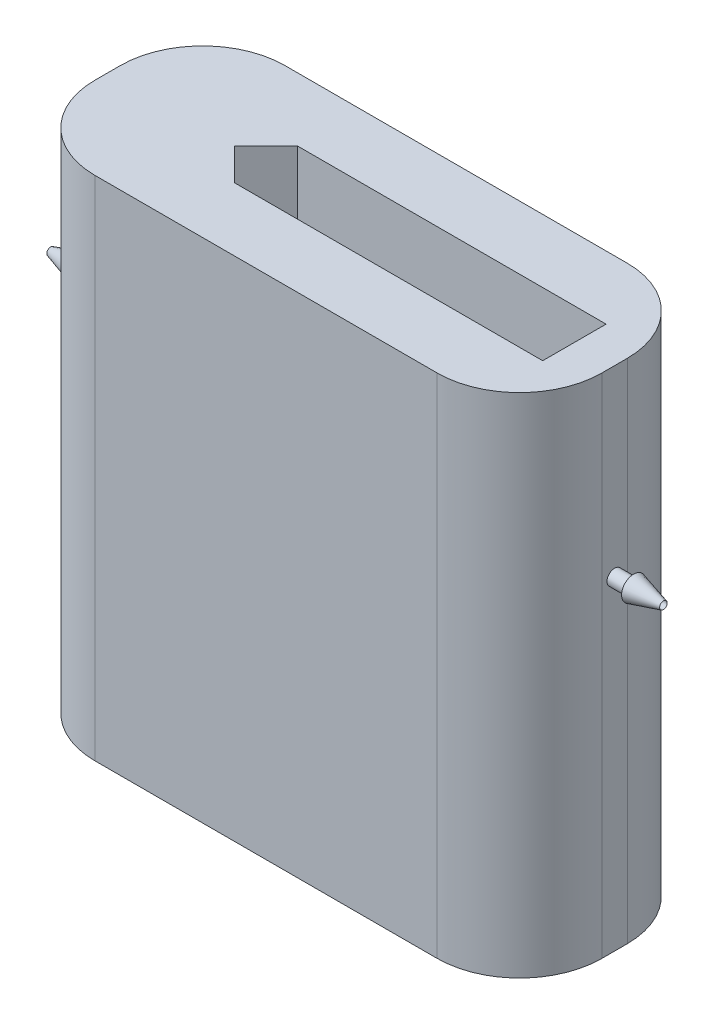
ISO-10303-21;
HEADER;
FILE_DESCRIPTION(('STEP AP214'),'2;1');
FILE_NAME('part.step','',(''),(''),'','','');
FILE_SCHEMA(('AUTOMOTIVE_DESIGN { 1 0 10303 214 1 1 1 1 }'));
ENDSEC;
DATA;
#1=APPLICATION_CONTEXT('core data for automotive mechanical design processes');
#2=APPLICATION_PROTOCOL_DEFINITION('international standard','automotive_design',2000,#1);
#3=PRODUCT_CONTEXT('',#1,'mechanical');
#4=PRODUCT('Part','Part','',(#3));
#5=PRODUCT_RELATED_PRODUCT_CATEGORY('part','',(#4));
#6=PRODUCT_DEFINITION_FORMATION('','',#4);
#7=PRODUCT_DEFINITION_CONTEXT('part definition',#1,'design');
#8=PRODUCT_DEFINITION('design','',#6,#7);
#9=PRODUCT_DEFINITION_SHAPE('','',#8);
#10=(LENGTH_UNIT() NAMED_UNIT(*) SI_UNIT(.MILLI.,.METRE.));
#11=(NAMED_UNIT(*) PLANE_ANGLE_UNIT() SI_UNIT($,.RADIAN.));
#12=(NAMED_UNIT(*) SI_UNIT($,.STERADIAN.) SOLID_ANGLE_UNIT());
#13=UNCERTAINTY_MEASURE_WITH_UNIT(LENGTH_MEASURE(1.E-05),#10,'distance_accuracy_value','');
#14=(GEOMETRIC_REPRESENTATION_CONTEXT(3) GLOBAL_UNCERTAINTY_ASSIGNED_CONTEXT((#13)) GLOBAL_UNIT_ASSIGNED_CONTEXT((#10,
#11,#12)) REPRESENTATION_CONTEXT('',''));
#15=CARTESIAN_POINT('',(0.,0.,0.));
#16=DIRECTION('',(0.,0.,1.));
#17=DIRECTION('',(1.,0.,0.));
#18=AXIS2_PLACEMENT_3D('',#15,#16,#17);
#19=CARTESIAN_POINT('',(43.,51.1119598949633,0.));
#20=DIRECTION('',(-1.,0.,0.));
#21=DIRECTION('',(0.,0.,1.));
#22=AXIS2_PLACEMENT_3D('',#19,#20,#21);
#23=PLANE('',#22);
#24=CARTESIAN_POINT('',(43.,51.1119598949633,0.));
#25=DIRECTION('',(-1.,0.,0.));
#26=DIRECTION('',(0.,0.,1.));
#27=AXIS2_PLACEMENT_3D('',#24,#25,#26);
#28=CIRCLE('',#27,0.800000000000001);
#29=CARTESIAN_POINT('',(43.,51.1119598949633,0.800000000000001));
#30=VERTEX_POINT('',#29);
#31=EDGE_CURVE('E54',#30,#30,#28,.T.);
#32=ORIENTED_EDGE('',*,*,#31,.F.);
#33=EDGE_LOOP('',(#32));
#34=FACE_BOUND('',#33,.T.);
#35=CARTESIAN_POINT('',(43.,51.1119598949633,0.));
#36=DIRECTION('',(-1.,0.,0.));
#37=DIRECTION('',(0.,0.,1.));
#38=AXIS2_PLACEMENT_3D('',#35,#36,#37);
#39=CIRCLE('',#38,1.90135651755513);
#40=CARTESIAN_POINT('',(43.,51.1119598949633,1.90135651755513));
#41=VERTEX_POINT('',#40);
#42=EDGE_CURVE('E11',#41,#41,#39,.T.);
#43=ORIENTED_EDGE('',*,*,#42,.T.);
#44=EDGE_LOOP('',(#43));
#45=FACE_BOUND('',#44,.T.);
#46=ADVANCED_FACE('F51',(#34,#45),#23,.T.);
#47=CARTESIAN_POINT('',(47.7051492827357,51.1119598949633,0.));
#48=DIRECTION('',(-1.,0.,0.));
#49=DIRECTION('',(0.,0.,1.));
#50=AXIS2_PLACEMENT_3D('',#47,#48,#49);
#51=CONICAL_SURFACE('',#50,0.600000000000003,0.269835779667187);
#52=CARTESIAN_POINT('',(47.7051492827357,51.1119598949633,0.));
#53=DIRECTION('',(1.,0.,0.));
#54=DIRECTION('',(0.,0.,-1.));
#55=AXIS2_PLACEMENT_3D('',#52,#53,#54);
#56=CIRCLE('',#55,0.600000000000002);
#57=CARTESIAN_POINT('',(47.7051492827357,51.1119598949633,0.600000000000004));
#58=VERTEX_POINT('',#57);
#59=EDGE_CURVE('E58',#58,#58,#56,.T.);
#60=CARTESIAN_POINT('',(43.,51.1119598949633,1.90135651755513));
#61=CARTESIAN_POINT('',(43.0490119716952,51.1119598949633,1.88780072049726));
#62=CARTESIAN_POINT('',(43.0980239433903,51.1119598949633,1.8742449234394));
#63=CARTESIAN_POINT('',(43.1960478867807,51.1119598949633,1.84713332932367));
#64=CARTESIAN_POINT('',(43.2450598584758,51.1119598949633,1.8335775322658));
#65=CARTESIAN_POINT('',(43.3430838018662,51.1119598949633,1.80646593815007));
#66=CARTESIAN_POINT('',(43.3920957735613,51.1119598949633,1.7929101410922));
#67=CARTESIAN_POINT('',(43.4901197169516,51.1119598949633,1.76579854697647));
#68=CARTESIAN_POINT('',(43.5391316886468,51.1119598949633,1.7522427499186));
#69=CARTESIAN_POINT('',(43.6371556320371,51.1119598949633,1.72513115580287));
#70=CARTESIAN_POINT('',(43.6861676037323,51.1119598949633,1.71157535874501));
#71=CARTESIAN_POINT('',(43.7841915471226,51.1119598949633,1.68446376462928));
#72=CARTESIAN_POINT('',(43.8332035188178,51.1119598949633,1.67090796757141));
#73=CARTESIAN_POINT('',(43.9312274622081,51.1119598949633,1.64379637345568));
#74=CARTESIAN_POINT('',(43.9802394339033,51.1119598949633,1.63024057639781));
#75=CARTESIAN_POINT('',(44.0782633772936,51.1119598949633,1.60312898228208));
#76=CARTESIAN_POINT('',(44.1272753489888,51.1119598949633,1.58957318522421));
#77=CARTESIAN_POINT('',(44.2252992923791,51.1119598949633,1.56246159110848));
#78=CARTESIAN_POINT('',(44.2743112640743,51.1119598949633,1.54890579405062));
#79=CARTESIAN_POINT('',(44.3723352074646,51.1119598949633,1.52179419993488));
#80=CARTESIAN_POINT('',(44.4213471791598,51.1119598949633,1.50823840287702));
#81=CARTESIAN_POINT('',(44.5193711225501,51.1119598949633,1.48112680876129));
#82=CARTESIAN_POINT('',(44.5683830942452,51.1119598949633,1.46757101170342));
#83=CARTESIAN_POINT('',(44.6664070376356,51.1119598949633,1.44045941758769));
#84=CARTESIAN_POINT('',(44.7154190093307,51.1119598949633,1.42690362052982));
#85=CARTESIAN_POINT('',(44.8134429527211,51.1119598949633,1.39979202641409));
#86=CARTESIAN_POINT('',(44.8624549244162,51.1119598949633,1.38623622935623));
#87=CARTESIAN_POINT('',(44.9604788678066,51.1119598949633,1.35912463524049));
#88=CARTESIAN_POINT('',(45.0094908395017,51.1119598949633,1.34556883818263));
#89=CARTESIAN_POINT('',(45.107514782892,51.1119598949633,1.3184572440669));
#90=CARTESIAN_POINT('',(45.1565267545872,51.1119598949633,1.30490144700903));
#91=CARTESIAN_POINT('',(45.2545506979775,51.1119598949633,1.2777898528933));
#92=CARTESIAN_POINT('',(45.3035626696727,51.1119598949633,1.26423405583543));
#93=CARTESIAN_POINT('',(45.401586613063,51.1119598949633,1.2371224617197));
#94=CARTESIAN_POINT('',(45.4505985847582,51.1119598949633,1.22356666466184));
#95=CARTESIAN_POINT('',(45.5486225281485,51.1119598949633,1.1964550705461));
#96=CARTESIAN_POINT('',(45.5976344998437,51.1119598949633,1.18289927348824));
#97=CARTESIAN_POINT('',(45.695658443234,51.1119598949633,1.15578767937251));
#98=CARTESIAN_POINT('',(45.7446704149292,51.1119598949633,1.14223188231464));
#99=CARTESIAN_POINT('',(45.8426943583195,51.1119598949633,1.11512028819891));
#100=CARTESIAN_POINT('',(45.8917063300147,51.1119598949633,1.10156449114104));
#101=CARTESIAN_POINT('',(45.989730273405,51.1119598949633,1.07445289702531));
#102=CARTESIAN_POINT('',(46.0387422451002,51.1119598949633,1.06089709996744));
#103=CARTESIAN_POINT('',(46.1367661884905,51.1119598949633,1.03378550585171));
#104=CARTESIAN_POINT('',(46.1857781601856,51.1119598949633,1.02022970879385));
#105=CARTESIAN_POINT('',(46.283802103576,51.1119598949633,0.993118114678115));
#106=CARTESIAN_POINT('',(46.3328140752711,51.1119598949633,0.979562317620249));
#107=CARTESIAN_POINT('',(46.4308380186615,51.1119598949633,0.952450723504517));
#108=CARTESIAN_POINT('',(46.4798499903566,51.1119598949633,0.938894926446652));
#109=CARTESIAN_POINT('',(46.577873933747,51.1119598949633,0.91178333233092));
#110=CARTESIAN_POINT('',(46.6268859054421,51.1119598949633,0.898227535273054));
#111=CARTESIAN_POINT('',(46.7249098488324,51.1119598949633,0.871115941157322));
#112=CARTESIAN_POINT('',(46.7739218205276,51.1119598949633,0.857560144099456));
#113=CARTESIAN_POINT('',(46.8719457639179,51.1119598949633,0.830448549983725));
#114=CARTESIAN_POINT('',(46.9209577356131,51.1119598949633,0.816892752925859));
#115=CARTESIAN_POINT('',(47.0189816790034,51.1119598949633,0.789781158810127));
#116=CARTESIAN_POINT('',(47.0679936506986,51.1119598949633,0.776225361752261));
#117=CARTESIAN_POINT('',(47.1660175940889,51.1119598949633,0.749113767636529));
#118=CARTESIAN_POINT('',(47.2150295657841,51.1119598949633,0.735557970578663));
#119=CARTESIAN_POINT('',(47.3130535091744,51.1119598949633,0.708446376462931));
#120=CARTESIAN_POINT('',(47.3620654808696,51.1119598949633,0.694890579405065));
#121=CARTESIAN_POINT('',(47.4600894242599,51.1119598949633,0.667778985289334));
#122=CARTESIAN_POINT('',(47.5091013959551,51.1119598949633,0.654223188231468));
#123=CARTESIAN_POINT('',(47.6071253393454,51.1119598949633,0.627111594115736));
#124=CARTESIAN_POINT('',(47.6561373110406,51.1119598949633,0.61355579705787));
#125=CARTESIAN_POINT('',(47.7051492827357,51.1119598949633,0.600000000000004));
#126=B_SPLINE_CURVE_WITH_KNOTS('',3,(#60,#61,#62,#63,#64,#65,#66,#67,#68,#69,#70,#71,#72,#73,
#74,#75,#76,#77,#78,#79,#80,#81,#82,#83,#84,#85,#86,#87,#88,#89,#90,#91,#92,#93,#94,#95,#96,#97,
#98,#99,#100,#101,#102,#103,#104,#105,#106,#107,#108,#109,#110,#111,#112,#113,#114,#115,#116,
#117,#118,#119,#120,#121,#122,#123,#124,#125),.UNSPECIFIED.,.F.,.F.,(4,2,2,2,2,2,2,2,2,2,2,2,2,
2,2,2,2,2,2,2,2,2,2,2,2,2,2,2,2,2,2,2,4),(0.,0.152556209411141,0.305112418822276,
0.45766862823341,0.610224837644544,0.762781047055679,0.915337256466813,1.06789346587795,
1.22044967528909,1.37300588470022,1.52556209411136,1.67811830352249,1.83067451293363,
1.98323072234477,2.1357869317559,2.28834314116704,2.44089935057817,2.59345555998931,
2.74601176940044,2.89856797881158,3.05112418822272,3.20368039763385,3.35623660704499,
3.50879281645612,3.66134902586725,3.81390523527839,3.96646144468953,4.11901765410066,
4.2715738635118,4.42413007292293,4.57668628233407,4.7292424917452,4.88179870115634),.UNSPECIFIED.);
#127=EDGE_CURVE('BSEAM77',#41,#58,#126,.T.);
#128=ORIENTED_EDGE('',*,*,#42,.F.);
#129=ORIENTED_EDGE('',*,*,#59,.F.);
#130=ORIENTED_EDGE('',*,*,#127,.T.);
#131=ORIENTED_EDGE('',*,*,#127,.F.);
#132=EDGE_LOOP('',(#128,#130,#129,#131));
#133=FACE_BOUND('',#132,.T.);
#134=ADVANCED_FACE('F77',(#133),#51,.T.);
#135=CARTESIAN_POINT('',(45.7051492827357,51.1119598949633,0.));
#136=DIRECTION('',(1.,0.,0.));
#137=DIRECTION('',(0.,0.,-1.));
#138=AXIS2_PLACEMENT_3D('',#135,#136,#137);
#139=CYLINDRICAL_SURFACE('',#138,0.600000000000002);
#140=CARTESIAN_POINT('',(45.7051492827357,51.1119598949633,0.));
#141=DIRECTION('',(1.,0.,0.));
#142=DIRECTION('',(0.,0.,-1.));
#143=AXIS2_PLACEMENT_3D('',#140,#141,#142);
#144=CIRCLE('',#143,0.600000000000002);
#145=CARTESIAN_POINT('',(45.7051492827357,51.1119598949633,-0.600000000000002));
#146=VERTEX_POINT('',#145);
#147=EDGE_CURVE('E62',#146,#146,#144,.T.);
#148=ORIENTED_EDGE('',*,*,#147,.F.);
#149=EDGE_LOOP('',(#148));
#150=FACE_BOUND('',#149,.T.);
#151=ORIENTED_EDGE('',*,*,#59,.T.);
#152=EDGE_LOOP('',(#151));
#153=FACE_BOUND('',#152,.T.);
#154=ADVANCED_FACE('F81',(#150,#153),#139,.F.);
#155=CARTESIAN_POINT('',(10.7051492827357,51.1119598949633,0.));
#156=DIRECTION('',(1.,0.,0.));
#157=DIRECTION('',(0.,0.,-1.));
#158=AXIS2_PLACEMENT_3D('',#155,#156,#157);
#159=CYLINDRICAL_SURFACE('',#158,0.800000000000001);
#160=ORIENTED_EDGE('',*,*,#31,.T.);
#161=EDGE_LOOP('',(#160));
#162=FACE_BOUND('',#161,.T.);
#163=CARTESIAN_POINT('',(45.7051492827357,51.1119598949633,0.));
#164=DIRECTION('',(1.,0.,0.));
#165=DIRECTION('',(0.,0.,-1.));
#166=AXIS2_PLACEMENT_3D('',#163,#164,#165);
#167=CIRCLE('',#166,0.800000000000001);
#168=CARTESIAN_POINT('',(45.7051492827357,51.1119598949633,-0.800000000000001));
#169=VERTEX_POINT('',#168);
#170=EDGE_CURVE('E67',#169,#169,#167,.T.);
#171=ORIENTED_EDGE('',*,*,#170,.T.);
#172=EDGE_LOOP('',(#171));
#173=FACE_BOUND('',#172,.T.);
#174=ADVANCED_FACE('F74',(#162,#173),#159,.F.);
#175=CARTESIAN_POINT('',(45.7051492827357,51.1119598949633,0.));
#176=DIRECTION('',(1.,0.,0.));
#177=DIRECTION('',(0.,0.,-1.));
#178=AXIS2_PLACEMENT_3D('',#175,#176,#177);
#179=PLANE('',#178);
#180=ORIENTED_EDGE('',*,*,#147,.T.);
#181=EDGE_LOOP('',(#180));
#182=FACE_BOUND('',#181,.T.);
#183=ORIENTED_EDGE('',*,*,#170,.F.);
#184=EDGE_LOOP('',(#183));
#185=FACE_BOUND('',#184,.T.);
#186=ADVANCED_FACE('F92',(#182,#185),#179,.F.);
#187=CLOSED_SHELL('',(#46,#134,#154,#174,#186));
#188=MANIFOLD_SOLID_BREP('B2',#187);
#189=CARTESIAN_POINT('',(40.,80.,15.));
#190=DIRECTION('',(-1.,0.,0.));
#191=DIRECTION('',(0.,0.,1.));
#192=AXIS2_PLACEMENT_3D('',#189,#190,#191);
#193=PLANE('',#192);
#194=DIRECTION('',(0.,0.,-1.));
#195=VECTOR('',#194,1.);
#196=CARTESIAN_POINT('',(40.,0.,15.));
#197=LINE('',#196,#195);
#198=CARTESIAN_POINT('',(40.,0.,2.));
#199=VERTEX_POINT('',#198);
#200=CARTESIAN_POINT('',(40.,0.,-2.));
#201=VERTEX_POINT('',#200);
#202=EDGE_CURVE('E291',#199,#201,#197,.T.);
#203=ORIENTED_EDGE('',*,*,#202,.T.);
#204=DIRECTION('',(0.,-1.,0.));
#205=VECTOR('',#204,1.);
#206=CARTESIAN_POINT('',(40.,80.,-2.));
#207=LINE('',#206,#205);
#208=CARTESIAN_POINT('',(40.,80.,-2.));
#209=VERTEX_POINT('',#208);
#210=EDGE_CURVE('E343',#201,#209,#207,.F.);
#211=ORIENTED_EDGE('',*,*,#210,.T.);
#212=DIRECTION('',(0.,0.,-1.));
#213=VECTOR('',#212,1.);
#214=CARTESIAN_POINT('',(40.,80.,15.));
#215=LINE('',#214,#213);
#216=CARTESIAN_POINT('',(40.,80.,2.));
#217=VERTEX_POINT('',#216);
#218=EDGE_CURVE('E277',#217,#209,#215,.T.);
#219=ORIENTED_EDGE('',*,*,#218,.F.);
#220=DIRECTION('',(0.,-1.,0.));
#221=VECTOR('',#220,1.);
#222=CARTESIAN_POINT('',(40.,80.,2.));
#223=LINE('',#222,#221);
#224=EDGE_CURVE('E339',#217,#199,#223,.T.);
#225=ORIENTED_EDGE('',*,*,#224,.T.);
#226=EDGE_LOOP('',(#203,#211,#219,#225));
#227=FACE_BOUND('',#226,.T.);
#228=CARTESIAN_POINT('',(40.,51.1119598949633,0.));
#229=DIRECTION('',(-1.,0.,0.));
#230=DIRECTION('',(0.,0.,1.));
#231=AXIS2_PLACEMENT_3D('',#228,#229,#230);
#232=CIRCLE('',#231,1.2);
#233=CARTESIAN_POINT('',(40.,51.1119598949633,1.2));
#234=VERTEX_POINT('',#233);
#235=EDGE_CURVE('E49',#234,#234,#232,.F.);
#236=ORIENTED_EDGE('',*,*,#235,.F.);
#237=EDGE_LOOP('',(#236));
#238=FACE_BOUND('',#237,.T.);
#239=ADVANCED_FACE('F138',(#227,#238),#193,.F.);
#240=CARTESIAN_POINT('',(-40.,80.,15.));
#241=DIRECTION('',(1.,0.,0.));
#242=DIRECTION('',(0.,0.,-1.));
#243=AXIS2_PLACEMENT_3D('',#240,#241,#242);
#244=PLANE('',#243);
#245=CARTESIAN_POINT('',(-40.,51.1119598949633,0.));
#246=DIRECTION('',(1.,0.,0.));
#247=DIRECTION('',(0.,0.,-1.));
#248=AXIS2_PLACEMENT_3D('',#245,#246,#247);
#249=CIRCLE('',#248,0.800000000000001);
#250=CARTESIAN_POINT('',(-40.,51.1119598949633,-0.800000000000001));
#251=VERTEX_POINT('',#250);
#252=EDGE_CURVE('E398',#251,#251,#249,.T.);
#253=ORIENTED_EDGE('',*,*,#252,.T.);
#254=EDGE_LOOP('',(#253));
#255=FACE_BOUND('',#254,.T.);
#256=CARTESIAN_POINT('',(-40.,51.1119598949633,0.));
#257=DIRECTION('',(-1.,0.,0.));
#258=DIRECTION('',(0.,0.,1.));
#259=AXIS2_PLACEMENT_3D('',#256,#257,#258);
#260=CIRCLE('',#259,1.2);
#261=CARTESIAN_POINT('',(-40.,51.1119598949633,1.2));
#262=VERTEX_POINT('',#261);
#263=EDGE_CURVE('E421',#262,#262,#260,.T.);
#264=ORIENTED_EDGE('',*,*,#263,.T.);
#265=EDGE_LOOP('',(#264));
#266=FACE_BOUND('',#265,.T.);
#267=ADVANCED_FACE('F463',(#255,#266),#244,.F.);
#268=CARTESIAN_POINT('',(-40.,80.,-15.));
#269=DIRECTION('',(0.,0.,1.));
#270=DIRECTION('',(1.,0.,0.));
#271=AXIS2_PLACEMENT_3D('',#268,#269,#270);
#272=PLANE('',#271);
#273=DIRECTION('',(-1.,0.,0.));
#274=VECTOR('',#273,1.);
#275=CARTESIAN_POINT('',(-40.,80.,-15.));
#276=LINE('',#275,#274);
#277=CARTESIAN_POINT('',(27.,80.,-15.));
#278=VERTEX_POINT('',#277);
#279=CARTESIAN_POINT('',(-27.,80.,-15.));
#280=VERTEX_POINT('',#279);
#281=EDGE_CURVE('E281',#278,#280,#276,.T.);
#282=ORIENTED_EDGE('',*,*,#281,.F.);
#283=DIRECTION('',(0.,-1.,0.));
#284=VECTOR('',#283,1.);
#285=CARTESIAN_POINT('',(27.,80.,-15.));
#286=LINE('',#285,#284);
#287=CARTESIAN_POINT('',(27.,0.,-15.));
#288=VERTEX_POINT('',#287);
#289=EDGE_CURVE('E323',#278,#288,#286,.T.);
#290=ORIENTED_EDGE('',*,*,#289,.T.);
#291=DIRECTION('',(-1.,0.,0.));
#292=VECTOR('',#291,1.);
#293=CARTESIAN_POINT('',(-40.,0.,-15.));
#294=LINE('',#293,#292);
#295=CARTESIAN_POINT('',(-27.,0.,-15.));
#296=VERTEX_POINT('',#295);
#297=EDGE_CURVE('E295',#288,#296,#294,.T.);
#298=ORIENTED_EDGE('',*,*,#297,.T.);
#299=DIRECTION('',(0.,-1.,0.));
#300=VECTOR('',#299,1.);
#301=CARTESIAN_POINT('',(-27.,80.,-15.));
#302=LINE('',#301,#300);
#303=EDGE_CURVE('E309',#296,#280,#302,.F.);
#304=ORIENTED_EDGE('',*,*,#303,.T.);
#305=EDGE_LOOP('',(#282,#290,#298,#304));
#306=FACE_BOUND('',#305,.T.);
#307=ADVANCED_FACE('F469',(#306),#272,.F.);
#308=CARTESIAN_POINT('',(-40.,51.1119598949633,0.));
#309=DIRECTION('',(1.,0.,0.));
#310=DIRECTION('',(0.,0.,-1.));
#311=AXIS2_PLACEMENT_3D('',#308,#309,#310);
#312=CIRCLE('',#311,1.5);
#313=CARTESIAN_POINT('',(-40.,51.1119598949633,-1.5));
#314=VERTEX_POINT('',#313);
#315=EDGE_CURVE('E249',#314,#314,#312,.F.);
#316=ORIENTED_EDGE('',*,*,#315,.F.);
#317=EDGE_LOOP('',(#316));
#318=FACE_BOUND('',#317,.T.);
#319=DIRECTION('',(0.,0.,1.));
#320=VECTOR('',#319,1.);
#321=CARTESIAN_POINT('',(-40.,80.,15.));
#322=LINE('',#321,#320);
#323=CARTESIAN_POINT('',(-40.,80.,-2.));
#324=VERTEX_POINT('',#323);
#325=CARTESIAN_POINT('',(-40.,80.,2.));
#326=VERTEX_POINT('',#325);
#327=EDGE_CURVE('E286',#324,#326,#322,.T.);
#328=ORIENTED_EDGE('',*,*,#327,.F.);
#329=DIRECTION('',(0.,-1.,0.));
#330=VECTOR('',#329,1.);
#331=CARTESIAN_POINT('',(-40.,80.,-2.));
#332=LINE('',#331,#330);
#333=CARTESIAN_POINT('',(-40.,0.,-2.));
#334=VERTEX_POINT('',#333);
#335=EDGE_CURVE('E360',#324,#334,#332,.T.);
#336=ORIENTED_EDGE('',*,*,#335,.T.);
#337=DIRECTION('',(0.,0.,1.));
#338=VECTOR('',#337,1.);
#339=CARTESIAN_POINT('',(-40.,0.,15.));
#340=LINE('',#339,#338);
#341=CARTESIAN_POINT('',(-40.,0.,2.));
#342=VERTEX_POINT('',#341);
#343=EDGE_CURVE('E300',#334,#342,#340,.T.);
#344=ORIENTED_EDGE('',*,*,#343,.T.);
#345=DIRECTION('',(0.,-1.,0.));
#346=VECTOR('',#345,1.);
#347=CARTESIAN_POINT('',(-40.,80.,2.));
#348=LINE('',#347,#346);
#349=EDGE_CURVE('E357',#342,#326,#348,.F.);
#350=ORIENTED_EDGE('',*,*,#349,.T.);
#351=EDGE_LOOP('',(#328,#336,#344,#350));
#352=FACE_BOUND('',#351,.T.);
#353=ADVANCED_FACE('F472',(#318,#352),#244,.F.);
#354=CARTESIAN_POINT('',(-40.,80.,15.));
#355=DIRECTION('',(0.,0.,-1.));
#356=DIRECTION('',(-1.,0.,0.));
#357=AXIS2_PLACEMENT_3D('',#354,#355,#356);
#358=PLANE('',#357);
#359=DIRECTION('',(1.,0.,0.));
#360=VECTOR('',#359,1.);
#361=CARTESIAN_POINT('',(-40.,0.,15.));
#362=LINE('',#361,#360);
#363=CARTESIAN_POINT('',(-27.,0.,15.));
#364=VERTEX_POINT('',#363);
#365=CARTESIAN_POINT('',(27.,0.,15.));
#366=VERTEX_POINT('',#365);
#367=EDGE_CURVE('E282',#364,#366,#362,.T.);
#368=ORIENTED_EDGE('',*,*,#367,.T.);
#369=DIRECTION('',(0.,-1.,0.));
#370=VECTOR('',#369,1.);
#371=CARTESIAN_POINT('',(27.,80.,15.));
#372=LINE('',#371,#370);
#373=CARTESIAN_POINT('',(27.,80.,15.));
#374=VERTEX_POINT('',#373);
#375=EDGE_CURVE('E147',#366,#374,#372,.F.);
#376=ORIENTED_EDGE('',*,*,#375,.T.);
#377=DIRECTION('',(1.,0.,0.));
#378=VECTOR('',#377,1.);
#379=CARTESIAN_POINT('',(-40.,80.,15.));
#380=LINE('',#379,#378);
#381=CARTESIAN_POINT('',(-27.,80.,15.));
#382=VERTEX_POINT('',#381);
#383=EDGE_CURVE('E250',#382,#374,#380,.T.);
#384=ORIENTED_EDGE('',*,*,#383,.F.);
#385=DIRECTION('',(0.,-1.,0.));
#386=VECTOR('',#385,1.);
#387=CARTESIAN_POINT('',(-27.,80.,15.));
#388=LINE('',#387,#386);
#389=EDGE_CURVE('E364',#382,#364,#388,.T.);
#390=ORIENTED_EDGE('',*,*,#389,.T.);
#391=EDGE_LOOP('',(#368,#376,#384,#390));
#392=FACE_BOUND('',#391,.T.);
#393=ADVANCED_FACE('F508',(#392),#358,.F.);
#394=CARTESIAN_POINT('',(0.,80.,0.));
#395=DIRECTION('',(0.,-1.,0.));
#396=DIRECTION('',(0.,0.,-1.));
#397=AXIS2_PLACEMENT_3D('',#394,#395,#396);
#398=PLANE('',#397);
#399=DIRECTION('',(0.707106781186548,0.,0.707106781186547));
#400=VECTOR('',#399,1.);
#401=CARTESIAN_POINT('',(-14.9999999999993,80.,5.));
#402=LINE('',#401,#400);
#403=CARTESIAN_POINT('',(-19.9999999999997,80.,-3.34801630863524E-13));
#404=VERTEX_POINT('',#403);
#405=CARTESIAN_POINT('',(-14.9999999999993,80.,5.));
#406=VERTEX_POINT('',#405);
#407=EDGE_CURVE('E391',#404,#406,#402,.T.);
#408=ORIENTED_EDGE('',*,*,#407,.F.);
#409=DIRECTION('',(-0.707106781186548,0.,0.707106781186548));
#410=VECTOR('',#409,1.);
#411=CARTESIAN_POINT('',(-19.9999999999997,80.,-3.35235311732518E-13));
#412=LINE('',#411,#410);
#413=CARTESIAN_POINT('',(-15.,80.,-5.));
#414=VERTEX_POINT('',#413);
#415=EDGE_CURVE('E395',#414,#404,#412,.T.);
#416=ORIENTED_EDGE('',*,*,#415,.F.);
#417=DIRECTION('',(-1.,0.,0.));
#418=VECTOR('',#417,1.);
#419=CARTESIAN_POINT('',(-15.,80.,-5.));
#420=LINE('',#419,#418);
#421=CARTESIAN_POINT('',(33.657016572987,80.,-5.));
#422=VERTEX_POINT('',#421);
#423=EDGE_CURVE('E380',#422,#414,#420,.T.);
#424=ORIENTED_EDGE('',*,*,#423,.F.);
#425=DIRECTION('',(0.,0.,-1.));
#426=VECTOR('',#425,1.);
#427=CARTESIAN_POINT('',(33.657016572987,80.,-5.));
#428=LINE('',#427,#426);
#429=CARTESIAN_POINT('',(33.657016572987,80.,5.));
#430=VERTEX_POINT('',#429);
#431=EDGE_CURVE('E385',#430,#422,#428,.T.);
#432=ORIENTED_EDGE('',*,*,#431,.F.);
#433=DIRECTION('',(1.,0.,0.));
#434=VECTOR('',#433,1.);
#435=CARTESIAN_POINT('',(33.657016572987,80.,5.));
#436=LINE('',#435,#434);
#437=EDGE_CURVE('E388',#406,#430,#436,.T.);
#438=ORIENTED_EDGE('',*,*,#437,.F.);
#439=EDGE_LOOP('',(#408,#416,#424,#432,#438));
#440=FACE_BOUND('',#439,.T.);
#441=ORIENTED_EDGE('',*,*,#218,.T.);
#442=CARTESIAN_POINT('',(27.,80.,-2.));
#443=DIRECTION('',(0.,-1.,0.));
#444=DIRECTION('',(0.,0.,-1.));
#445=AXIS2_PLACEMENT_3D('',#442,#443,#444);
#446=CIRCLE('',#445,13.);
#447=EDGE_CURVE('E354',#209,#278,#446,.F.);
#448=ORIENTED_EDGE('',*,*,#447,.T.);
#449=ORIENTED_EDGE('',*,*,#281,.T.);
#450=CARTESIAN_POINT('',(-27.,80.,-2.));
#451=DIRECTION('',(0.,-1.,0.));
#452=DIRECTION('',(0.,0.,-1.));
#453=AXIS2_PLACEMENT_3D('',#450,#451,#452);
#454=CIRCLE('',#453,13.);
#455=EDGE_CURVE('E351',#280,#324,#454,.F.);
#456=ORIENTED_EDGE('',*,*,#455,.T.);
#457=ORIENTED_EDGE('',*,*,#327,.T.);
#458=CARTESIAN_POINT('',(-27.,80.,2.));
#459=DIRECTION('',(0.,-1.,0.));
#460=DIRECTION('',(0.,0.,-1.));
#461=AXIS2_PLACEMENT_3D('',#458,#459,#460);
#462=CIRCLE('',#461,13.);
#463=EDGE_CURVE('E160',#326,#382,#462,.F.);
#464=ORIENTED_EDGE('',*,*,#463,.T.);
#465=ORIENTED_EDGE('',*,*,#383,.T.);
#466=CARTESIAN_POINT('',(27.,80.,2.));
#467=DIRECTION('',(0.,-1.,0.));
#468=DIRECTION('',(0.,0.,-1.));
#469=AXIS2_PLACEMENT_3D('',#466,#467,#468);
#470=CIRCLE('',#469,13.);
#471=EDGE_CURVE('E348',#374,#217,#470,.F.);
#472=ORIENTED_EDGE('',*,*,#471,.T.);
#473=EDGE_LOOP('',(#441,#448,#449,#456,#457,#464,#465,#472));
#474=FACE_BOUND('',#473,.T.);
#475=ADVANCED_FACE('F491',(#440,#474),#398,.F.);
#476=CARTESIAN_POINT('',(0.,0.,0.));
#477=DIRECTION('',(0.,-1.,0.));
#478=DIRECTION('',(0.,0.,-1.));
#479=AXIS2_PLACEMENT_3D('',#476,#477,#478);
#480=PLANE('',#479);
#481=ORIENTED_EDGE('',*,*,#297,.F.);
#482=CARTESIAN_POINT('',(27.,0.,-2.));
#483=DIRECTION('',(0.,-1.,0.));
#484=DIRECTION('',(0.,0.,-1.));
#485=AXIS2_PLACEMENT_3D('',#482,#483,#484);
#486=CIRCLE('',#485,13.);
#487=EDGE_CURVE('E336',#288,#201,#486,.T.);
#488=ORIENTED_EDGE('',*,*,#487,.T.);
#489=ORIENTED_EDGE('',*,*,#202,.F.);
#490=CARTESIAN_POINT('',(27.,0.,2.));
#491=DIRECTION('',(0.,-1.,0.));
#492=DIRECTION('',(0.,0.,-1.));
#493=AXIS2_PLACEMENT_3D('',#490,#491,#492);
#494=CIRCLE('',#493,13.);
#495=EDGE_CURVE('E330',#199,#366,#494,.T.);
#496=ORIENTED_EDGE('',*,*,#495,.T.);
#497=ORIENTED_EDGE('',*,*,#367,.F.);
#498=CARTESIAN_POINT('',(-27.,0.,2.));
#499=DIRECTION('',(0.,-1.,0.));
#500=DIRECTION('',(0.,0.,-1.));
#501=AXIS2_PLACEMENT_3D('',#498,#499,#500);
#502=CIRCLE('',#501,13.);
#503=EDGE_CURVE('E327',#364,#342,#502,.T.);
#504=ORIENTED_EDGE('',*,*,#503,.T.);
#505=ORIENTED_EDGE('',*,*,#343,.F.);
#506=CARTESIAN_POINT('',(-27.,0.,-2.));
#507=DIRECTION('',(0.,-1.,0.));
#508=DIRECTION('',(0.,0.,-1.));
#509=AXIS2_PLACEMENT_3D('',#506,#507,#508);
#510=CIRCLE('',#509,13.);
#511=EDGE_CURVE('E333',#334,#296,#510,.T.);
#512=ORIENTED_EDGE('',*,*,#511,.T.);
#513=EDGE_LOOP('',(#481,#488,#489,#496,#497,#504,#505,#512));
#514=FACE_BOUND('',#513,.T.);
#515=ADVANCED_FACE('F510',(#514),#480,.T.);
#516=CARTESIAN_POINT('',(-19.9999999999997,5.,-3.35235311732518E-13));
#517=DIRECTION('',(-0.707106781186548,0.,-0.707106781186548));
#518=DIRECTION('',(-0.707106781186548,0.,0.707106781186548));
#519=AXIS2_PLACEMENT_3D('',#516,#517,#518);
#520=PLANE('',#519);
#521=DIRECTION('',(0.,1.,0.));
#522=VECTOR('',#521,1.);
#523=CARTESIAN_POINT('',(-19.9999999999997,5.,-3.35235311732518E-13));
#524=LINE('',#523,#522);
#525=CARTESIAN_POINT('',(-19.9999999999997,51.9119598949633,-3.35235311732518E-13));
#526=VERTEX_POINT('',#525);
#527=EDGE_CURVE('E258',#526,#404,#524,.T.);
#528=ORIENTED_EDGE('',*,*,#527,.F.);
#529=CARTESIAN_POINT('',(-20.,51.1119598949633,0.));
#530=DIRECTION('',(-0.707106781186548,0.,-0.707106781186548));
#531=DIRECTION('',(-0.707106781186548,0.,0.707106781186548));
#532=AXIS2_PLACEMENT_3D('',#529,#530,#531);
#533=ELLIPSE('',#532,1.13137084989848,0.800000000000001);
#534=CARTESIAN_POINT('',(-19.9999999999997,50.3119598949633,-3.35235311732518E-13));
#535=VERTEX_POINT('',#534);
#536=EDGE_CURVE('E244',#526,#535,#533,.T.);
#537=ORIENTED_EDGE('',*,*,#536,.T.);
#538=CARTESIAN_POINT('',(-19.9999999999997,5.,-3.35235311732518E-13));
#539=VERTEX_POINT('',#538);
#540=EDGE_CURVE('E255',#539,#535,#524,.T.);
#541=ORIENTED_EDGE('',*,*,#540,.F.);
#542=DIRECTION('',(-0.707106781186548,0.,0.707106781186548));
#543=VECTOR('',#542,1.);
#544=CARTESIAN_POINT('',(-19.9999999999997,5.,-3.35235311732518E-13));
#545=LINE('',#544,#543);
#546=CARTESIAN_POINT('',(-15.,5.,-5.));
#547=VERTEX_POINT('',#546);
#548=EDGE_CURVE('E384',#547,#539,#545,.T.);
#549=ORIENTED_EDGE('',*,*,#548,.F.);
#550=DIRECTION('',(0.,1.,0.));
#551=VECTOR('',#550,1.);
#552=CARTESIAN_POINT('',(-15.,5.,-5.));
#553=LINE('',#552,#551);
#554=EDGE_CURVE('E296',#547,#414,#553,.T.);
#555=ORIENTED_EDGE('',*,*,#554,.T.);
#556=ORIENTED_EDGE('',*,*,#415,.T.);
#557=EDGE_LOOP('',(#528,#537,#541,#549,#555,#556));
#558=FACE_BOUND('',#557,.T.);
#559=ADVANCED_FACE('F253',(#558),#520,.F.);
#560=CARTESIAN_POINT('',(-15.,5.,-5.));
#561=DIRECTION('',(0.,0.,-1.));
#562=DIRECTION('',(-1.,0.,0.));
#563=AXIS2_PLACEMENT_3D('',#560,#561,#562);
#564=PLANE('',#563);
#565=ORIENTED_EDGE('',*,*,#423,.T.);
#566=ORIENTED_EDGE('',*,*,#554,.F.);
#567=DIRECTION('',(-1.,0.,0.));
#568=VECTOR('',#567,1.);
#569=CARTESIAN_POINT('',(15.,5.,-5.));
#570=LINE('',#569,#568);
#571=CARTESIAN_POINT('',(33.657016572987,5.,-5.));
#572=VERTEX_POINT('',#571);
#573=EDGE_CURVE('E274',#572,#547,#570,.T.);
#574=ORIENTED_EDGE('',*,*,#573,.F.);
#575=DIRECTION('',(0.,1.,0.));
#576=VECTOR('',#575,1.);
#577=CARTESIAN_POINT('',(33.657016572987,5.,-5.));
#578=LINE('',#577,#576);
#579=EDGE_CURVE('E370',#572,#422,#578,.T.);
#580=ORIENTED_EDGE('',*,*,#579,.T.);
#581=EDGE_LOOP('',(#565,#566,#574,#580));
#582=FACE_BOUND('',#581,.T.);
#583=ADVANCED_FACE('F517',(#582),#564,.F.);
#584=CARTESIAN_POINT('',(33.657016572987,5.,-5.));
#585=DIRECTION('',(1.,0.,0.));
#586=DIRECTION('',(0.,0.,-1.));
#587=AXIS2_PLACEMENT_3D('',#584,#585,#586);
#588=PLANE('',#587);
#589=CARTESIAN_POINT('',(33.657016572987,51.1119598949633,0.));
#590=DIRECTION('',(1.,0.,0.));
#591=DIRECTION('',(0.,0.,-1.));
#592=AXIS2_PLACEMENT_3D('',#589,#590,#591);
#593=CIRCLE('',#592,0.800000000000001);
#594=CARTESIAN_POINT('',(33.657016572987,51.1119598949633,-0.800000000000001));
#595=VERTEX_POINT('',#594);
#596=EDGE_CURVE('E260',#595,#595,#593,.T.);
#597=ORIENTED_EDGE('',*,*,#596,.T.);
#598=EDGE_LOOP('',(#597));
#599=FACE_BOUND('',#598,.T.);
#600=ORIENTED_EDGE('',*,*,#431,.T.);
#601=ORIENTED_EDGE('',*,*,#579,.F.);
#602=DIRECTION('',(0.,0.,-1.));
#603=VECTOR('',#602,1.);
#604=CARTESIAN_POINT('',(33.657016572987,5.,-5.));
#605=LINE('',#604,#603);
#606=CARTESIAN_POINT('',(33.657016572987,5.,5.));
#607=VERTEX_POINT('',#606);
#608=EDGE_CURVE('E401',#607,#572,#605,.T.);
#609=ORIENTED_EDGE('',*,*,#608,.F.);
#610=DIRECTION('',(0.,1.,0.));
#611=VECTOR('',#610,1.);
#612=CARTESIAN_POINT('',(33.657016572987,5.,5.));
#613=LINE('',#612,#611);
#614=EDGE_CURVE('E272',#607,#430,#613,.T.);
#615=ORIENTED_EDGE('',*,*,#614,.T.);
#616=EDGE_LOOP('',(#600,#601,#609,#615));
#617=FACE_BOUND('',#616,.T.);
#618=ADVANCED_FACE('F554',(#599,#617),#588,.F.);
#619=CARTESIAN_POINT('',(33.657016572987,5.,5.));
#620=DIRECTION('',(0.,0.,1.));
#621=DIRECTION('',(1.,0.,0.));
#622=AXIS2_PLACEMENT_3D('',#619,#620,#621);
#623=PLANE('',#622);
#624=ORIENTED_EDGE('',*,*,#437,.T.);
#625=ORIENTED_EDGE('',*,*,#614,.F.);
#626=DIRECTION('',(1.,0.,0.));
#627=VECTOR('',#626,1.);
#628=CARTESIAN_POINT('',(15.,5.,5.));
#629=LINE('',#628,#627);
#630=CARTESIAN_POINT('',(-14.9999999999993,5.,5.));
#631=VERTEX_POINT('',#630);
#632=EDGE_CURVE('E405',#631,#607,#629,.T.);
#633=ORIENTED_EDGE('',*,*,#632,.F.);
#634=DIRECTION('',(0.,1.,0.));
#635=VECTOR('',#634,1.);
#636=CARTESIAN_POINT('',(-14.9999999999993,5.,5.));
#637=LINE('',#636,#635);
#638=EDGE_CURVE('E268',#631,#406,#637,.T.);
#639=ORIENTED_EDGE('',*,*,#638,.T.);
#640=EDGE_LOOP('',(#624,#625,#633,#639));
#641=FACE_BOUND('',#640,.T.);
#642=ADVANCED_FACE('F558',(#641),#623,.F.);
#643=CARTESIAN_POINT('',(-14.9999999999993,5.,5.));
#644=DIRECTION('',(-0.707106781186547,0.,0.707106781186548));
#645=DIRECTION('',(0.707106781186548,0.,0.707106781186547));
#646=AXIS2_PLACEMENT_3D('',#643,#644,#645);
#647=PLANE('',#646);
#648=ORIENTED_EDGE('',*,*,#540,.T.);
#649=CARTESIAN_POINT('',(-19.9999999999993,51.1119598949633,0.));
#650=DIRECTION('',(-0.707106781186547,0.,0.707106781186548));
#651=DIRECTION('',(-0.707106781186548,0.,-0.707106781186547));
#652=AXIS2_PLACEMENT_3D('',#649,#650,#651);
#653=ELLIPSE('',#652,1.13137084989848,0.800000000000001);
#654=EDGE_CURVE('E240',#535,#526,#653,.T.);
#655=ORIENTED_EDGE('',*,*,#654,.T.);
#656=ORIENTED_EDGE('',*,*,#527,.T.);
#657=ORIENTED_EDGE('',*,*,#407,.T.);
#658=ORIENTED_EDGE('',*,*,#638,.F.);
#659=DIRECTION('',(0.707106781186548,0.,0.707106781186547));
#660=VECTOR('',#659,1.);
#661=CARTESIAN_POINT('',(-14.9999999999993,5.,5.));
#662=LINE('',#661,#660);
#663=EDGE_CURVE('E265',#539,#631,#662,.T.);
#664=ORIENTED_EDGE('',*,*,#663,.F.);
#665=EDGE_LOOP('',(#648,#655,#656,#657,#658,#664));
#666=FACE_BOUND('',#665,.T.);
#667=ADVANCED_FACE('F263',(#666),#647,.F.);
#668=CARTESIAN_POINT('',(0.,5.,0.));
#669=DIRECTION('',(0.,1.,0.));
#670=DIRECTION('',(0.,0.,1.));
#671=AXIS2_PLACEMENT_3D('',#668,#669,#670);
#672=PLANE('',#671);
#673=ORIENTED_EDGE('',*,*,#548,.T.);
#674=ORIENTED_EDGE('',*,*,#663,.T.);
#675=ORIENTED_EDGE('',*,*,#632,.T.);
#676=ORIENTED_EDGE('',*,*,#608,.T.);
#677=ORIENTED_EDGE('',*,*,#573,.T.);
#678=EDGE_LOOP('',(#673,#674,#675,#676,#677));
#679=FACE_BOUND('',#678,.T.);
#680=ADVANCED_FACE('F548',(#679),#672,.T.);
#681=CARTESIAN_POINT('',(40.,51.1119598949633,0.));
#682=DIRECTION('',(-1.,0.,0.));
#683=DIRECTION('',(0.,0.,1.));
#684=AXIS2_PLACEMENT_3D('',#681,#682,#683);
#685=CYLINDRICAL_SURFACE('',#684,0.800000000000001);
#686=ORIENTED_EDGE('',*,*,#654,.F.);
#687=ORIENTED_EDGE('',*,*,#536,.F.);
#688=EDGE_LOOP('',(#686,#687));
#689=FACE_BOUND('',#688,.T.);
#690=ORIENTED_EDGE('',*,*,#252,.F.);
#691=EDGE_LOOP('',(#690));
#692=FACE_BOUND('',#691,.T.);
#693=ADVANCED_FACE('F242',(#689,#692),#685,.F.);
#694=ORIENTED_EDGE('',*,*,#596,.F.);
#695=EDGE_LOOP('',(#694));
#696=FACE_BOUND('',#695,.T.);
#697=CARTESIAN_POINT('',(43.,51.1119598949633,0.));
#698=DIRECTION('',(1.,0.,0.));
#699=DIRECTION('',(0.,0.,-1.));
#700=AXIS2_PLACEMENT_3D('',#697,#698,#699);
#701=CIRCLE('',#700,0.800000000000001);
#702=CARTESIAN_POINT('',(43.,51.1119598949633,-0.800000000000001));
#703=VERTEX_POINT('',#702);
#704=EDGE_CURVE('E442',#703,#703,#701,.T.);
#705=ORIENTED_EDGE('',*,*,#704,.T.);
#706=EDGE_LOOP('',(#705));
#707=FACE_BOUND('',#706,.T.);
#708=ADVANCED_FACE('F447',(#696,#707),#685,.F.);
#709=CARTESIAN_POINT('',(-43.,51.1119598949633,0.));
#710=DIRECTION('',(1.,0.,0.));
#711=DIRECTION('',(0.,0.,-1.));
#712=AXIS2_PLACEMENT_3D('',#709,#710,#711);
#713=CYLINDRICAL_SURFACE('',#712,1.5);
#714=CARTESIAN_POINT('',(-43.,51.1119598949633,0.));
#715=DIRECTION('',(-1.,0.,0.));
#716=DIRECTION('',(0.,0.,1.));
#717=AXIS2_PLACEMENT_3D('',#714,#715,#716);
#718=CIRCLE('',#717,1.5);
#719=CARTESIAN_POINT('',(-43.,51.1119598949633,1.5));
#720=VERTEX_POINT('',#719);
#721=EDGE_CURVE('E261',#720,#720,#718,.T.);
#722=ORIENTED_EDGE('',*,*,#721,.F.);
#723=EDGE_LOOP('',(#722));
#724=FACE_BOUND('',#723,.T.);
#725=ORIENTED_EDGE('',*,*,#315,.T.);
#726=EDGE_LOOP('',(#725));
#727=FACE_BOUND('',#726,.T.);
#728=ADVANCED_FACE('F530',(#724,#727),#713,.T.);
#729=CARTESIAN_POINT('',(-43.,51.1119598949633,0.));
#730=DIRECTION('',(1.,0.,0.));
#731=DIRECTION('',(0.,0.,-1.));
#732=AXIS2_PLACEMENT_3D('',#729,#730,#731);
#733=CYLINDRICAL_SURFACE('',#732,1.2);
#734=CARTESIAN_POINT('',(-43.,51.1119598949633,0.));
#735=DIRECTION('',(-1.,0.,0.));
#736=DIRECTION('',(0.,0.,1.));
#737=AXIS2_PLACEMENT_3D('',#734,#735,#736);
#738=CIRCLE('',#737,1.2);
#739=CARTESIAN_POINT('',(-43.,51.1119598949633,1.2));
#740=VERTEX_POINT('',#739);
#741=EDGE_CURVE('E425',#740,#740,#738,.T.);
#742=ORIENTED_EDGE('',*,*,#741,.T.);
#743=EDGE_LOOP('',(#742));
#744=FACE_BOUND('',#743,.T.);
#745=ORIENTED_EDGE('',*,*,#263,.F.);
#746=EDGE_LOOP('',(#745));
#747=FACE_BOUND('',#746,.T.);
#748=ADVANCED_FACE('F532',(#744,#747),#733,.F.);
#749=CARTESIAN_POINT('',(-43.,51.1119598949633,0.));
#750=DIRECTION('',(1.,0.,0.));
#751=DIRECTION('',(0.,0.,-1.));
#752=AXIS2_PLACEMENT_3D('',#749,#750,#751);
#753=PLANE('',#752);
#754=CARTESIAN_POINT('',(-43.,51.1119598949633,0.));
#755=DIRECTION('',(1.,0.,0.));
#756=DIRECTION('',(0.,0.,-1.));
#757=AXIS2_PLACEMENT_3D('',#754,#755,#756);
#758=CIRCLE('',#757,0.800000000000001);
#759=CARTESIAN_POINT('',(-43.,51.1119598949633,-0.800000000000001));
#760=VERTEX_POINT('',#759);
#761=EDGE_CURVE('E316',#760,#760,#758,.T.);
#762=ORIENTED_EDGE('',*,*,#761,.F.);
#763=EDGE_LOOP('',(#762));
#764=FACE_BOUND('',#763,.T.);
#765=ORIENTED_EDGE('',*,*,#741,.F.);
#766=EDGE_LOOP('',(#765));
#767=FACE_BOUND('',#766,.T.);
#768=ADVANCED_FACE('F539',(#764,#767),#753,.T.);
#769=CARTESIAN_POINT('',(-43.,51.1119598949633,0.));
#770=DIRECTION('',(1.,0.,0.));
#771=DIRECTION('',(0.,0.,-1.));
#772=AXIS2_PLACEMENT_3D('',#769,#770,#771);
#773=CONICAL_SURFACE('',#772,2.4,0.291809754815074);
#774=CARTESIAN_POINT('',(-48.9923145065775,51.1119598949633,0.));
#775=DIRECTION('',(1.,0.,0.));
#776=DIRECTION('',(0.,0.,-1.));
#777=AXIS2_PLACEMENT_3D('',#774,#775,#776);
#778=CIRCLE('',#777,0.600000000000001);
#779=CARTESIAN_POINT('',(-48.9923145065775,51.1119598949633,-0.599999999999999));
#780=VERTEX_POINT('',#779);
#781=EDGE_CURVE('E310',#780,#780,#778,.F.);
#782=CARTESIAN_POINT('',(-43.,51.1119598949633,0.));
#783=DIRECTION('',(1.,0.,0.));
#784=DIRECTION('',(0.,0.,-1.));
#785=AXIS2_PLACEMENT_3D('',#782,#783,#784);
#786=CIRCLE('',#785,2.4);
#787=CARTESIAN_POINT('',(-43.,51.1119598949633,-2.4));
#788=VERTEX_POINT('',#787);
#789=EDGE_CURVE('E314',#788,#788,#786,.T.);
#790=CARTESIAN_POINT('',(-48.9923145065775,51.1119598949633,-0.599999999999999));
#791=CARTESIAN_POINT('',(-48.9298945638007,51.1119598949633,-0.61875));
#792=CARTESIAN_POINT('',(-48.8674746210238,51.1119598949633,-0.637499999999999));
#793=CARTESIAN_POINT('',(-48.7426347354701,51.1119598949633,-0.674999999999999));
#794=CARTESIAN_POINT('',(-48.6802147926933,51.1119598949633,-0.693749999999999));
#795=CARTESIAN_POINT('',(-48.5553749071396,51.1119598949633,-0.731249999999999));
#796=CARTESIAN_POINT('',(-48.4929549643627,51.1119598949633,-0.749999999999999));
#797=CARTESIAN_POINT('',(-48.368115078809,51.1119598949633,-0.787499999999999));
#798=CARTESIAN_POINT('',(-48.3056951360322,51.1119598949633,-0.806249999999999));
#799=CARTESIAN_POINT('',(-48.1808552504785,51.1119598949633,-0.843749999999999));
#800=CARTESIAN_POINT('',(-48.1184353077016,51.1119598949633,-0.862499999999999));
#801=CARTESIAN_POINT('',(-47.9935954221479,51.1119598949633,-0.899999999999999));
#802=CARTESIAN_POINT('',(-47.9311754793711,51.1119598949633,-0.918749999999999));
#803=CARTESIAN_POINT('',(-47.8063355938174,51.1119598949633,-0.956249999999999));
#804=CARTESIAN_POINT('',(-47.7439156510405,51.1119598949633,-0.974999999999999));
#805=CARTESIAN_POINT('',(-47.6190757654868,51.1119598949633,-1.0125));
#806=CARTESIAN_POINT('',(-47.55665582271,51.1119598949633,-1.03125));
#807=CARTESIAN_POINT('',(-47.4318159371563,51.1119598949633,-1.06875));
#808=CARTESIAN_POINT('',(-47.3693959943794,51.1119598949633,-1.0875));
#809=CARTESIAN_POINT('',(-47.2445561088257,51.1119598949633,-1.125));
#810=CARTESIAN_POINT('',(-47.1821361660489,51.1119598949633,-1.14375));
#811=CARTESIAN_POINT('',(-47.0572962804952,51.1119598949633,-1.18125));
#812=CARTESIAN_POINT('',(-46.9948763377184,51.1119598949633,-1.2));
#813=CARTESIAN_POINT('',(-46.8700364521646,51.1119598949633,-1.2375));
#814=CARTESIAN_POINT('',(-46.8076165093878,51.1119598949633,-1.25625));
#815=CARTESIAN_POINT('',(-46.6827766238341,51.1119598949633,-1.29375));
#816=CARTESIAN_POINT('',(-46.6203566810573,51.1119598949633,-1.3125));
#817=CARTESIAN_POINT('',(-46.4955167955036,51.1119598949633,-1.35));
#818=CARTESIAN_POINT('',(-46.4330968527267,51.1119598949633,-1.36875));
#819=CARTESIAN_POINT('',(-46.308256967173,51.1119598949633,-1.40625));
#820=CARTESIAN_POINT('',(-46.2458370243962,51.1119598949633,-1.425));
#821=CARTESIAN_POINT('',(-46.1209971388424,51.1119598949633,-1.4625));
#822=CARTESIAN_POINT('',(-46.0585771960656,51.1119598949633,-1.48125));
#823=CARTESIAN_POINT('',(-45.9337373105119,51.1119598949633,-1.51875));
#824=CARTESIAN_POINT('',(-45.8713173677351,51.1119598949633,-1.5375));
#825=CARTESIAN_POINT('',(-45.7464774821814,51.1119598949633,-1.575));
#826=CARTESIAN_POINT('',(-45.6840575394045,51.1119598949633,-1.59375));
#827=CARTESIAN_POINT('',(-45.5592176538508,51.1119598949633,-1.63125));
#828=CARTESIAN_POINT('',(-45.496797711074,51.1119598949633,-1.65));
#829=CARTESIAN_POINT('',(-45.3719578255203,51.1119598949633,-1.6875));
#830=CARTESIAN_POINT('',(-45.3095378827434,51.1119598949633,-1.70625));
#831=CARTESIAN_POINT('',(-45.1846979971897,51.1119598949633,-1.74375));
#832=CARTESIAN_POINT('',(-45.1222780544129,51.1119598949633,-1.7625));
#833=CARTESIAN_POINT('',(-44.9974381688592,51.1119598949633,-1.8));
#834=CARTESIAN_POINT('',(-44.9350182260823,51.1119598949633,-1.81875));
#835=CARTESIAN_POINT('',(-44.8101783405286,51.1119598949633,-1.85625));
#836=CARTESIAN_POINT('',(-44.7477583977518,51.1119598949633,-1.875));
#837=CARTESIAN_POINT('',(-44.6229185121981,51.1119598949633,-1.9125));
#838=CARTESIAN_POINT('',(-44.5604985694212,51.1119598949633,-1.93125));
#839=CARTESIAN_POINT('',(-44.4356586838675,51.1119598949633,-1.96875));
#840=CARTESIAN_POINT('',(-44.3732387410907,51.1119598949633,-1.9875));
#841=CARTESIAN_POINT('',(-44.248398855537,51.1119598949633,-2.025));
#842=CARTESIAN_POINT('',(-44.1859789127601,51.1119598949633,-2.04375));
#843=CARTESIAN_POINT('',(-44.0611390272064,51.1119598949633,-2.08125));
#844=CARTESIAN_POINT('',(-43.9987190844296,51.1119598949633,-2.1));
#845=CARTESIAN_POINT('',(-43.8738791988759,51.1119598949633,-2.1375));
#846=CARTESIAN_POINT('',(-43.811459256099,51.1119598949633,-2.15625));
#847=CARTESIAN_POINT('',(-43.6866193705453,51.1119598949633,-2.19375));
#848=CARTESIAN_POINT('',(-43.6241994277685,51.1119598949633,-2.2125));
#849=CARTESIAN_POINT('',(-43.4993595422148,51.1119598949633,-2.25));
#850=CARTESIAN_POINT('',(-43.4369395994379,51.1119598949633,-2.26875));
#851=CARTESIAN_POINT('',(-43.3120997138842,51.1119598949633,-2.30625));
#852=CARTESIAN_POINT('',(-43.2496797711074,51.1119598949633,-2.325));
#853=CARTESIAN_POINT('',(-43.1248398855537,51.1119598949633,-2.3625));
#854=CARTESIAN_POINT('',(-43.0624199427768,51.1119598949633,-2.38125));
#855=CARTESIAN_POINT('',(-43.,51.1119598949633,-2.4));
#856=B_SPLINE_CURVE_WITH_KNOTS('',3,(#790,#791,#792,#793,#794,#795,#796,#797,#798,#799,#800,
#801,#802,#803,#804,#805,#806,#807,#808,#809,#810,#811,#812,#813,#814,#815,#816,#817,#818,#819,
#820,#821,#822,#823,#824,#825,#826,#827,#828,#829,#830,#831,#832,#833,#834,#835,#836,#837,#838,
#839,#840,#841,#842,#843,#844,#845,#846,#847,#848,#849,#850,#851,#852,#853,#854,#855),
.UNSPECIFIED.,.F.,.F.,(4,2,2,2,2,2,2,2,2,2,2,2,2,2,2,2,2,2,2,2,2,2,2,2,2,2,2,2,2,2,2,2,4),(0.,
0.195525716483505,0.391051432967009,0.586577149450507,0.782102865934012,0.97762858241751,
1.17315429890101,1.36868001538451,1.56420573186802,1.75973144835152,1.95525716483502,
2.15078288131852,2.34630859780202,2.54183431428552,2.73736003076903,2.93288574725253,
3.12841146373603,3.32393718021953,3.51946289670303,3.71498861318654,3.91051432967003,
4.10604004615354,4.30156576263704,4.49709147912054,4.69261719560404,4.88814291208754,
5.08366862857104,5.27919434505455,5.47472006153804,5.67024577802155,5.86577149450505,
6.06129721098855,6.25682292747205),.UNSPECIFIED.);
#857=EDGE_CURVE('BSEAM666',#780,#788,#856,.T.);
#858=ORIENTED_EDGE('',*,*,#781,.F.);
#859=ORIENTED_EDGE('',*,*,#789,.F.);
#860=ORIENTED_EDGE('',*,*,#857,.T.);
#861=ORIENTED_EDGE('',*,*,#857,.F.);
#862=EDGE_LOOP('',(#858,#860,#859,#861));
#863=FACE_BOUND('',#862,.T.);
#864=ADVANCED_FACE('F666',(#863),#773,.T.);
#865=ORIENTED_EDGE('',*,*,#721,.T.);
#866=EDGE_LOOP('',(#865));
#867=FACE_BOUND('',#866,.T.);
#868=ORIENTED_EDGE('',*,*,#789,.T.);
#869=EDGE_LOOP('',(#868));
#870=FACE_BOUND('',#869,.T.);
#871=ADVANCED_FACE('F656',(#867,#870),#753,.T.);
#872=CARTESIAN_POINT('',(-47.3252208680541,51.1119598949633,0.));
#873=DIRECTION('',(-1.,0.,0.));
#874=DIRECTION('',(0.,0.,1.));
#875=AXIS2_PLACEMENT_3D('',#872,#873,#874);
#876=CYLINDRICAL_SURFACE('',#875,0.600000000000001);
#877=ORIENTED_EDGE('',*,*,#781,.T.);
#878=EDGE_LOOP('',(#877));
#879=FACE_BOUND('',#878,.T.);
#880=CARTESIAN_POINT('',(-47.3252208680541,51.1119598949633,0.));
#881=DIRECTION('',(-1.,0.,0.));
#882=DIRECTION('',(0.,0.,1.));
#883=AXIS2_PLACEMENT_3D('',#880,#881,#882);
#884=CIRCLE('',#883,0.600000000000001);
#885=CARTESIAN_POINT('',(-47.3252208680541,51.1119598949633,0.600000000000001));
#886=VERTEX_POINT('',#885);
#887=EDGE_CURVE('E315',#886,#886,#884,.T.);
#888=ORIENTED_EDGE('',*,*,#887,.F.);
#889=EDGE_LOOP('',(#888));
#890=FACE_BOUND('',#889,.T.);
#891=ADVANCED_FACE('F646',(#879,#890),#876,.F.);
#892=CARTESIAN_POINT('',(5.67477913194588,51.1119598949633,0.));
#893=DIRECTION('',(-1.,0.,0.));
#894=DIRECTION('',(0.,0.,1.));
#895=AXIS2_PLACEMENT_3D('',#892,#893,#894);
#896=CYLINDRICAL_SURFACE('',#895,0.800000000000001);
#897=ORIENTED_EDGE('',*,*,#761,.T.);
#898=EDGE_LOOP('',(#897));
#899=FACE_BOUND('',#898,.T.);
#900=CARTESIAN_POINT('',(-47.3252208680541,51.1119598949633,0.));
#901=DIRECTION('',(-1.,0.,0.));
#902=DIRECTION('',(0.,0.,1.));
#903=AXIS2_PLACEMENT_3D('',#900,#901,#902);
#904=CIRCLE('',#903,0.800000000000001);
#905=CARTESIAN_POINT('',(-47.3252208680541,51.1119598949633,0.800000000000001));
#906=VERTEX_POINT('',#905);
#907=EDGE_CURVE('E320',#906,#906,#904,.T.);
#908=ORIENTED_EDGE('',*,*,#907,.T.);
#909=EDGE_LOOP('',(#908));
#910=FACE_BOUND('',#909,.T.);
#911=ADVANCED_FACE('F636',(#899,#910),#896,.F.);
#912=CARTESIAN_POINT('',(-47.3252208680541,51.1119598949633,0.));
#913=DIRECTION('',(-1.,0.,0.));
#914=DIRECTION('',(0.,0.,1.));
#915=AXIS2_PLACEMENT_3D('',#912,#913,#914);
#916=PLANE('',#915);
#917=ORIENTED_EDGE('',*,*,#887,.T.);
#918=EDGE_LOOP('',(#917));
#919=FACE_BOUND('',#918,.T.);
#920=ORIENTED_EDGE('',*,*,#907,.F.);
#921=EDGE_LOOP('',(#920));
#922=FACE_BOUND('',#921,.T.);
#923=ADVANCED_FACE('F480',(#919,#922),#916,.F.);
#924=CARTESIAN_POINT('',(27.,80.,-2.));
#925=DIRECTION('',(0.,-1.,0.));
#926=DIRECTION('',(0.,0.,-1.));
#927=AXIS2_PLACEMENT_3D('',#924,#925,#926);
#928=CYLINDRICAL_SURFACE('',#927,13.);
#929=ORIENTED_EDGE('',*,*,#447,.F.);
#930=ORIENTED_EDGE('',*,*,#210,.F.);
#931=ORIENTED_EDGE('',*,*,#487,.F.);
#932=ORIENTED_EDGE('',*,*,#289,.F.);
#933=EDGE_LOOP('',(#929,#930,#931,#932));
#934=FACE_BOUND('',#933,.T.);
#935=ADVANCED_FACE('F476',(#934),#928,.T.);
#936=CARTESIAN_POINT('',(-27.,80.,-2.));
#937=DIRECTION('',(0.,-1.,0.));
#938=DIRECTION('',(0.,0.,-1.));
#939=AXIS2_PLACEMENT_3D('',#936,#937,#938);
#940=CYLINDRICAL_SURFACE('',#939,13.);
#941=ORIENTED_EDGE('',*,*,#455,.F.);
#942=ORIENTED_EDGE('',*,*,#303,.F.);
#943=ORIENTED_EDGE('',*,*,#511,.F.);
#944=ORIENTED_EDGE('',*,*,#335,.F.);
#945=EDGE_LOOP('',(#941,#942,#943,#944));
#946=FACE_BOUND('',#945,.T.);
#947=ADVANCED_FACE('F479',(#946),#940,.T.);
#948=CARTESIAN_POINT('',(27.,80.,2.));
#949=DIRECTION('',(0.,-1.,0.));
#950=DIRECTION('',(0.,0.,-1.));
#951=AXIS2_PLACEMENT_3D('',#948,#949,#950);
#952=CYLINDRICAL_SURFACE('',#951,13.);
#953=ORIENTED_EDGE('',*,*,#471,.F.);
#954=ORIENTED_EDGE('',*,*,#375,.F.);
#955=ORIENTED_EDGE('',*,*,#495,.F.);
#956=ORIENTED_EDGE('',*,*,#224,.F.);
#957=EDGE_LOOP('',(#953,#954,#955,#956));
#958=FACE_BOUND('',#957,.T.);
#959=ADVANCED_FACE('F460',(#958),#952,.T.);
#960=CARTESIAN_POINT('',(-27.,80.,2.));
#961=DIRECTION('',(0.,-1.,0.));
#962=DIRECTION('',(0.,0.,-1.));
#963=AXIS2_PLACEMENT_3D('',#960,#961,#962);
#964=CYLINDRICAL_SURFACE('',#963,13.);
#965=ORIENTED_EDGE('',*,*,#463,.F.);
#966=ORIENTED_EDGE('',*,*,#349,.F.);
#967=ORIENTED_EDGE('',*,*,#503,.F.);
#968=ORIENTED_EDGE('',*,*,#389,.F.);
#969=EDGE_LOOP('',(#965,#966,#967,#968));
#970=FACE_BOUND('',#969,.T.);
#971=ADVANCED_FACE('F140',(#970),#964,.T.);
#972=CARTESIAN_POINT('',(43.,51.1119598949633,0.));
#973=DIRECTION('',(1.,0.,0.));
#974=DIRECTION('',(0.,0.,-1.));
#975=AXIS2_PLACEMENT_3D('',#972,#973,#974);
#976=PLANE('',#975);
#977=CARTESIAN_POINT('',(43.,51.1119598949633,0.));
#978=DIRECTION('',(1.,0.,0.));
#979=DIRECTION('',(0.,0.,-1.));
#980=AXIS2_PLACEMENT_3D('',#977,#978,#979);
#981=CIRCLE('',#980,1.2);
#982=CARTESIAN_POINT('',(43.,51.1119598949633,-1.2));
#983=VERTEX_POINT('',#982);
#984=EDGE_CURVE('E438',#983,#983,#981,.T.);
#985=ORIENTED_EDGE('',*,*,#984,.T.);
#986=EDGE_LOOP('',(#985));
#987=FACE_BOUND('',#986,.T.);
#988=ORIENTED_EDGE('',*,*,#704,.F.);
#989=EDGE_LOOP('',(#988));
#990=FACE_BOUND('',#989,.T.);
#991=ADVANCED_FACE('F449',(#987,#990),#976,.T.);
#992=CARTESIAN_POINT('',(43.,51.1119598949633,0.));
#993=DIRECTION('',(-1.,0.,0.));
#994=DIRECTION('',(0.,0.,1.));
#995=AXIS2_PLACEMENT_3D('',#992,#993,#994);
#996=CYLINDRICAL_SURFACE('',#995,1.2);
#997=ORIENTED_EDGE('',*,*,#984,.F.);
#998=EDGE_LOOP('',(#997));
#999=FACE_BOUND('',#998,.T.);
#1000=ORIENTED_EDGE('',*,*,#235,.T.);
#1001=EDGE_LOOP('',(#1000));
#1002=FACE_BOUND('',#1001,.T.);
#1003=ADVANCED_FACE('F451',(#999,#1002),#996,.T.);
#1004=CLOSED_SHELL('',(#239,#267,#307,#353,#393,#475,#515,#559,#583,#618,#642,#667,#680,#693,
#708,#728,#748,#768,#864,#871,#891,#911,#923,#935,#947,#959,#971,#991,#1003));
#1005=MANIFOLD_SOLID_BREP('B6',#1004);
#1006=ADVANCED_BREP_SHAPE_REPRESENTATION('',(#18,#188,#1005),#14);
#1007=SHAPE_DEFINITION_REPRESENTATION(#9,#1006);
ENDSEC;
END-ISO-10303-21;
